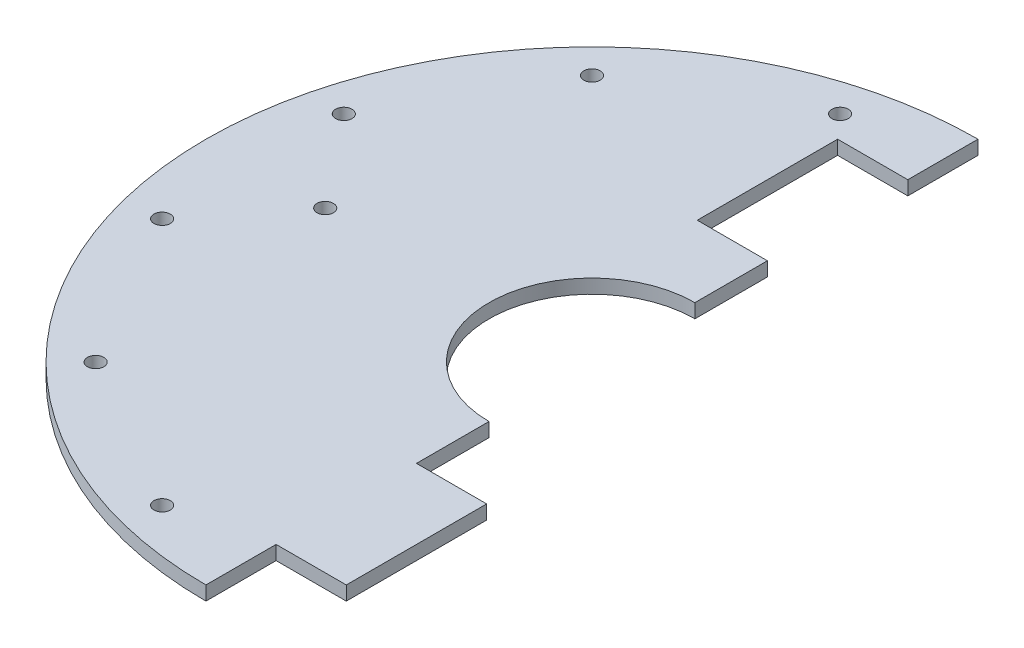
ISO-10303-21;
HEADER;
FILE_DESCRIPTION(('STEP AP214'),'2;1');
FILE_NAME('part.step','',(''),(''),'','','');
FILE_SCHEMA(('AUTOMOTIVE_DESIGN { 1 0 10303 214 1 1 1 1 }'));
ENDSEC;
DATA;
#1=APPLICATION_CONTEXT('core data for automotive mechanical design processes');
#2=APPLICATION_PROTOCOL_DEFINITION('international standard','automotive_design',2000,#1);
#3=PRODUCT_CONTEXT('',#1,'mechanical');
#4=PRODUCT('Part','Part','',(#3));
#5=PRODUCT_RELATED_PRODUCT_CATEGORY('part','',(#4));
#6=PRODUCT_DEFINITION_FORMATION('','',#4);
#7=PRODUCT_DEFINITION_CONTEXT('part definition',#1,'design');
#8=PRODUCT_DEFINITION('design','',#6,#7);
#9=PRODUCT_DEFINITION_SHAPE('','',#8);
#10=(LENGTH_UNIT() NAMED_UNIT(*) SI_UNIT(.MILLI.,.METRE.));
#11=(NAMED_UNIT(*) PLANE_ANGLE_UNIT() SI_UNIT($,.RADIAN.));
#12=(NAMED_UNIT(*) SI_UNIT($,.STERADIAN.) SOLID_ANGLE_UNIT());
#13=UNCERTAINTY_MEASURE_WITH_UNIT(LENGTH_MEASURE(1.E-05),#10,'distance_accuracy_value','');
#14=(GEOMETRIC_REPRESENTATION_CONTEXT(3) GLOBAL_UNCERTAINTY_ASSIGNED_CONTEXT((#13)) GLOBAL_UNIT_ASSIGNED_CONTEXT((#10,
#11,#12)) REPRESENTATION_CONTEXT('',''));
#15=CARTESIAN_POINT('',(0.,0.,0.));
#16=DIRECTION('',(0.,0.,1.));
#17=DIRECTION('',(1.,0.,0.));
#18=AXIS2_PLACEMENT_3D('',#15,#16,#17);
#19=CARTESIAN_POINT('',(0.,3.,0.));
#20=DIRECTION('',(0.,-1.,0.));
#21=DIRECTION('',(0.,0.,-1.));
#22=AXIS2_PLACEMENT_3D('',#19,#20,#21);
#23=CYLINDRICAL_SURFACE('',#22,82.5);
#24=DIRECTION('',(0.,1.,0.));
#25=VECTOR('',#24,1.);
#26=CARTESIAN_POINT('',(0.,0.,-82.5));
#27=LINE('',#26,#25);
#28=CARTESIAN_POINT('',(0.,0.,-82.5));
#29=VERTEX_POINT('',#28);
#30=CARTESIAN_POINT('',(0.,3.,-82.5));
#31=VERTEX_POINT('',#30);
#32=EDGE_CURVE('E128',#29,#31,#27,.T.);
#33=ORIENTED_EDGE('',*,*,#32,.F.);
#34=CARTESIAN_POINT('',(0.,0.,0.));
#35=DIRECTION('',(0.,1.,0.));
#36=DIRECTION('',(0.,0.,1.));
#37=AXIS2_PLACEMENT_3D('',#34,#35,#36);
#38=CIRCLE('',#37,82.5);
#39=CARTESIAN_POINT('',(0.,0.,82.5));
#40=VERTEX_POINT('',#39);
#41=EDGE_CURVE('E40',#29,#40,#38,.T.);
#42=ORIENTED_EDGE('',*,*,#41,.T.);
#43=DIRECTION('',(0.,1.,0.));
#44=VECTOR('',#43,1.);
#45=CARTESIAN_POINT('',(0.,0.,82.5));
#46=LINE('',#45,#44);
#47=CARTESIAN_POINT('',(0.,3.,82.5));
#48=VERTEX_POINT('',#47);
#49=EDGE_CURVE('E143',#40,#48,#46,.T.);
#50=ORIENTED_EDGE('',*,*,#49,.T.);
#51=CARTESIAN_POINT('',(0.,3.,0.));
#52=DIRECTION('',(0.,1.,0.));
#53=DIRECTION('',(0.,0.,1.));
#54=AXIS2_PLACEMENT_3D('',#51,#52,#53);
#55=CIRCLE('',#54,82.5);
#56=EDGE_CURVE('E11',#31,#48,#55,.T.);
#57=ORIENTED_EDGE('',*,*,#56,.F.);
#58=EDGE_LOOP('',(#33,#42,#50,#57));
#59=FACE_BOUND('',#58,.T.);
#60=ADVANCED_FACE('F37',(#59),#23,.T.);
#61=CARTESIAN_POINT('',(0.,3.,0.));
#62=DIRECTION('',(0.,1.,0.));
#63=DIRECTION('',(0.,0.,1.));
#64=AXIS2_PLACEMENT_3D('',#61,#62,#63);
#65=PLANE('',#64);
#66=DIRECTION('',(0.,0.,1.));
#67=VECTOR('',#66,1.);
#68=CARTESIAN_POINT('',(0.,3.,67.5));
#69=LINE('',#68,#67);
#70=CARTESIAN_POINT('',(0.,3.,67.5));
#71=VERTEX_POINT('',#70);
#72=EDGE_CURVE('E414',#71,#48,#69,.T.);
#73=ORIENTED_EDGE('',*,*,#72,.F.);
#74=DIRECTION('',(-1.,0.,0.));
#75=VECTOR('',#74,1.);
#76=CARTESIAN_POINT('',(15.,3.,67.5));
#77=LINE('',#76,#75);
#78=CARTESIAN_POINT('',(15.,3.,67.5));
#79=VERTEX_POINT('',#78);
#80=EDGE_CURVE('E384',#79,#71,#77,.T.);
#81=ORIENTED_EDGE('',*,*,#80,.F.);
#82=DIRECTION('',(0.,0.,1.));
#83=VECTOR('',#82,1.);
#84=CARTESIAN_POINT('',(15.,3.,37.5));
#85=LINE('',#84,#83);
#86=CARTESIAN_POINT('',(15.,3.,37.5));
#87=VERTEX_POINT('',#86);
#88=EDGE_CURVE('E382',#87,#79,#85,.T.);
#89=ORIENTED_EDGE('',*,*,#88,.F.);
#90=DIRECTION('',(1.,0.,0.));
#91=VECTOR('',#90,1.);
#92=CARTESIAN_POINT('',(0.,3.,37.5));
#93=LINE('',#92,#91);
#94=CARTESIAN_POINT('',(0.,3.,37.5));
#95=VERTEX_POINT('',#94);
#96=EDGE_CURVE('E375',#95,#87,#93,.T.);
#97=ORIENTED_EDGE('',*,*,#96,.F.);
#98=DIRECTION('',(0.,0.,1.));
#99=VECTOR('',#98,1.);
#100=CARTESIAN_POINT('',(0.,3.,22.));
#101=LINE('',#100,#99);
#102=CARTESIAN_POINT('',(0.,3.,22.));
#103=VERTEX_POINT('',#102);
#104=EDGE_CURVE('E369',#103,#95,#101,.T.);
#105=ORIENTED_EDGE('',*,*,#104,.F.);
#106=CARTESIAN_POINT('',(0.,3.,0.));
#107=DIRECTION('',(0.,1.,0.));
#108=DIRECTION('',(0.,0.,1.));
#109=AXIS2_PLACEMENT_3D('',#106,#107,#108);
#110=CIRCLE('',#109,22.);
#111=CARTESIAN_POINT('',(0.,3.,-22.));
#112=VERTEX_POINT('',#111);
#113=EDGE_CURVE('E152',#112,#103,#110,.T.);
#114=ORIENTED_EDGE('',*,*,#113,.F.);
#115=DIRECTION('',(0.,0.,1.));
#116=VECTOR('',#115,1.);
#117=CARTESIAN_POINT('',(0.,3.,-37.5));
#118=LINE('',#117,#116);
#119=CARTESIAN_POINT('',(0.,3.,-37.5));
#120=VERTEX_POINT('',#119);
#121=EDGE_CURVE('E51',#120,#112,#118,.T.);
#122=ORIENTED_EDGE('',*,*,#121,.F.);
#123=DIRECTION('',(1.,0.,0.));
#124=VECTOR('',#123,1.);
#125=CARTESIAN_POINT('',(-15.,3.,-37.5));
#126=LINE('',#125,#124);
#127=CARTESIAN_POINT('',(-15.,3.,-37.5));
#128=VERTEX_POINT('',#127);
#129=EDGE_CURVE('E389',#128,#120,#126,.T.);
#130=ORIENTED_EDGE('',*,*,#129,.F.);
#131=DIRECTION('',(0.,0.,1.));
#132=VECTOR('',#131,1.);
#133=CARTESIAN_POINT('',(-15.,3.,-67.5));
#134=LINE('',#133,#132);
#135=CARTESIAN_POINT('',(-15.,3.,-67.5));
#136=VERTEX_POINT('',#135);
#137=EDGE_CURVE('E392',#136,#128,#134,.T.);
#138=ORIENTED_EDGE('',*,*,#137,.F.);
#139=DIRECTION('',(-1.,0.,0.));
#140=VECTOR('',#139,1.);
#141=CARTESIAN_POINT('',(0.,3.,-67.5));
#142=LINE('',#141,#140);
#143=CARTESIAN_POINT('',(0.,3.,-67.5));
#144=VERTEX_POINT('',#143);
#145=EDGE_CURVE('E136',#144,#136,#142,.T.);
#146=ORIENTED_EDGE('',*,*,#145,.F.);
#147=DIRECTION('',(0.,0.,-1.));
#148=VECTOR('',#147,1.);
#149=CARTESIAN_POINT('',(0.,3.,-67.5));
#150=LINE('',#149,#148);
#151=EDGE_CURVE('E416',#144,#31,#150,.T.);
#152=ORIENTED_EDGE('',*,*,#151,.T.);
#153=ORIENTED_EDGE('',*,*,#56,.T.);
#154=EDGE_LOOP('',(#73,#81,#89,#97,#105,#114,#122,#130,#138,#146,#152,#153));
#155=FACE_BOUND('',#154,.T.);
#156=CARTESIAN_POINT('',(-19.4114283826883,3.,72.4444369716803));
#157=DIRECTION('',(0.,1.,0.));
#158=DIRECTION('',(-1.,0.,0.));
#159=AXIS2_PLACEMENT_3D('',#156,#157,#158);
#160=CIRCLE('',#159,1.75);
#161=CARTESIAN_POINT('',(-21.1614283826883,3.,72.4444369716803));
#162=VERTEX_POINT('',#161);
#163=EDGE_CURVE('E142',#162,#162,#160,.T.);
#164=ORIENTED_EDGE('',*,*,#163,.F.);
#165=EDGE_LOOP('',(#164));
#166=FACE_BOUND('',#165,.T.);
#167=CARTESIAN_POINT('',(-53.0330085889906,3.,53.0330085889915));
#168=DIRECTION('',(0.,1.,0.));
#169=DIRECTION('',(-0.866025403784443,0.,-0.499999999999992));
#170=AXIS2_PLACEMENT_3D('',#167,#168,#169);
#171=CIRCLE('',#170,1.75);
#172=CARTESIAN_POINT('',(-54.5485530456134,3.,52.1580085889915));
#173=VERTEX_POINT('',#172);
#174=EDGE_CURVE('E199',#173,#173,#171,.T.);
#175=ORIENTED_EDGE('',*,*,#174,.F.);
#176=EDGE_LOOP('',(#175));
#177=FACE_BOUND('',#176,.T.);
#178=CARTESIAN_POINT('',(-72.44443697168,3.,19.4114283826896));
#179=DIRECTION('',(0.,1.,0.));
#180=DIRECTION('',(-0.500000000000007,0.,-0.866025403784435));
#181=AXIS2_PLACEMENT_3D('',#178,#179,#180);
#182=CIRCLE('',#181,1.75);
#183=CARTESIAN_POINT('',(-73.31943697168,3.,17.8958839260668));
#184=VERTEX_POINT('',#183);
#185=EDGE_CURVE('E193',#184,#184,#182,.T.);
#186=ORIENTED_EDGE('',*,*,#185,.F.);
#187=EDGE_LOOP('',(#186));
#188=FACE_BOUND('',#187,.T.);
#189=CARTESIAN_POINT('',(-72.4444369716801,3.,-19.4114283826891));
#190=DIRECTION('',(0.,1.,0.));
#191=DIRECTION('',(0.,0.,-1.));
#192=AXIS2_PLACEMENT_3D('',#189,#190,#191);
#193=CIRCLE('',#192,1.75);
#194=CARTESIAN_POINT('',(-72.4444369716801,3.,-21.1614283826891));
#195=VERTEX_POINT('',#194);
#196=EDGE_CURVE('E187',#195,#195,#193,.T.);
#197=ORIENTED_EDGE('',*,*,#196,.F.);
#198=EDGE_LOOP('',(#197));
#199=FACE_BOUND('',#198,.T.);
#200=CARTESIAN_POINT('',(-53.0330085889913,3.,-53.0330085889908));
#201=DIRECTION('',(0.,1.,0.));
#202=DIRECTION('',(0.499999999999995,0.,-0.866025403784442));
#203=AXIS2_PLACEMENT_3D('',#200,#201,#202);
#204=CIRCLE('',#203,1.75);
#205=CARTESIAN_POINT('',(-52.1580085889914,3.,-54.5485530456136));
#206=VERTEX_POINT('',#205);
#207=EDGE_CURVE('E181',#206,#206,#204,.T.);
#208=ORIENTED_EDGE('',*,*,#207,.F.);
#209=EDGE_LOOP('',(#208));
#210=FACE_BOUND('',#209,.T.);
#211=CARTESIAN_POINT('',(-19.4114283826894,3.,-72.4444369716801));
#212=DIRECTION('',(0.,1.,0.));
#213=DIRECTION('',(0.866025403784436,0.,-0.500000000000004));
#214=AXIS2_PLACEMENT_3D('',#211,#212,#213);
#215=CIRCLE('',#214,1.75);
#216=CARTESIAN_POINT('',(-17.8958839260666,3.,-73.3194369716801));
#217=VERTEX_POINT('',#216);
#218=EDGE_CURVE('E170',#217,#217,#215,.T.);
#219=ORIENTED_EDGE('',*,*,#218,.F.);
#220=EDGE_LOOP('',(#219));
#221=FACE_BOUND('',#220,.T.);
#222=CARTESIAN_POINT('',(-57.,3.,0.));
#223=DIRECTION('',(0.,1.,0.));
#224=DIRECTION('',(0.,0.,1.));
#225=AXIS2_PLACEMENT_3D('',#222,#223,#224);
#226=CIRCLE('',#225,1.75);
#227=CARTESIAN_POINT('',(-57.,3.,1.75));
#228=VERTEX_POINT('',#227);
#229=EDGE_CURVE('E164',#228,#228,#226,.T.);
#230=ORIENTED_EDGE('',*,*,#229,.F.);
#231=EDGE_LOOP('',(#230));
#232=FACE_BOUND('',#231,.T.);
#233=ADVANCED_FACE('F209',(#155,#166,#177,#188,#199,#210,#221,#232),#65,.T.);
#234=CARTESIAN_POINT('',(0.,0.,0.));
#235=DIRECTION('',(0.,1.,0.));
#236=DIRECTION('',(0.,0.,1.));
#237=AXIS2_PLACEMENT_3D('',#234,#235,#236);
#238=PLANE('',#237);
#239=DIRECTION('',(-1.,0.,0.));
#240=VECTOR('',#239,1.);
#241=CARTESIAN_POINT('',(15.,0.,67.5));
#242=LINE('',#241,#240);
#243=CARTESIAN_POINT('',(15.,0.,67.5));
#244=VERTEX_POINT('',#243);
#245=CARTESIAN_POINT('',(0.,0.,67.5));
#246=VERTEX_POINT('',#245);
#247=EDGE_CURVE('E424',#244,#246,#242,.T.);
#248=ORIENTED_EDGE('',*,*,#247,.T.);
#249=DIRECTION('',(0.,0.,1.));
#250=VECTOR('',#249,1.);
#251=CARTESIAN_POINT('',(0.,0.,67.5));
#252=LINE('',#251,#250);
#253=EDGE_CURVE('E135',#246,#40,#252,.T.);
#254=ORIENTED_EDGE('',*,*,#253,.T.);
#255=ORIENTED_EDGE('',*,*,#41,.F.);
#256=DIRECTION('',(0.,0.,-1.));
#257=VECTOR('',#256,1.);
#258=CARTESIAN_POINT('',(0.,0.,-67.5));
#259=LINE('',#258,#257);
#260=CARTESIAN_POINT('',(0.,0.,-67.5));
#261=VERTEX_POINT('',#260);
#262=EDGE_CURVE('E124',#261,#29,#259,.T.);
#263=ORIENTED_EDGE('',*,*,#262,.F.);
#264=DIRECTION('',(-1.,0.,0.));
#265=VECTOR('',#264,1.);
#266=CARTESIAN_POINT('',(0.,0.,-67.5));
#267=LINE('',#266,#265);
#268=CARTESIAN_POINT('',(-15.,0.,-67.5));
#269=VERTEX_POINT('',#268);
#270=EDGE_CURVE('E399',#261,#269,#267,.T.);
#271=ORIENTED_EDGE('',*,*,#270,.T.);
#272=DIRECTION('',(0.,0.,1.));
#273=VECTOR('',#272,1.);
#274=CARTESIAN_POINT('',(-15.,0.,-67.5));
#275=LINE('',#274,#273);
#276=CARTESIAN_POINT('',(-15.,0.,-37.5));
#277=VERTEX_POINT('',#276);
#278=EDGE_CURVE('E438',#269,#277,#275,.T.);
#279=ORIENTED_EDGE('',*,*,#278,.T.);
#280=DIRECTION('',(1.,0.,0.));
#281=VECTOR('',#280,1.);
#282=CARTESIAN_POINT('',(-15.,0.,-37.5));
#283=LINE('',#282,#281);
#284=CARTESIAN_POINT('',(0.,0.,-37.5));
#285=VERTEX_POINT('',#284);
#286=EDGE_CURVE('E433',#277,#285,#283,.T.);
#287=ORIENTED_EDGE('',*,*,#286,.T.);
#288=DIRECTION('',(0.,0.,1.));
#289=VECTOR('',#288,1.);
#290=CARTESIAN_POINT('',(0.,0.,-37.5));
#291=LINE('',#290,#289);
#292=CARTESIAN_POINT('',(0.,0.,-22.));
#293=VERTEX_POINT('',#292);
#294=EDGE_CURVE('E431',#285,#293,#291,.T.);
#295=ORIENTED_EDGE('',*,*,#294,.T.);
#296=CARTESIAN_POINT('',(0.,0.,0.));
#297=DIRECTION('',(0.,1.,0.));
#298=DIRECTION('',(0.,0.,1.));
#299=AXIS2_PLACEMENT_3D('',#296,#297,#298);
#300=CIRCLE('',#299,22.);
#301=CARTESIAN_POINT('',(0.,0.,22.));
#302=VERTEX_POINT('',#301);
#303=EDGE_CURVE('E150',#293,#302,#300,.T.);
#304=ORIENTED_EDGE('',*,*,#303,.T.);
#305=DIRECTION('',(0.,0.,1.));
#306=VECTOR('',#305,1.);
#307=CARTESIAN_POINT('',(0.,0.,22.));
#308=LINE('',#307,#306);
#309=CARTESIAN_POINT('',(0.,0.,37.5));
#310=VERTEX_POINT('',#309);
#311=EDGE_CURVE('E59',#302,#310,#308,.T.);
#312=ORIENTED_EDGE('',*,*,#311,.T.);
#313=DIRECTION('',(1.,0.,0.));
#314=VECTOR('',#313,1.);
#315=CARTESIAN_POINT('',(0.,0.,37.5));
#316=LINE('',#315,#314);
#317=CARTESIAN_POINT('',(15.,0.,37.5));
#318=VERTEX_POINT('',#317);
#319=EDGE_CURVE('E429',#310,#318,#316,.T.);
#320=ORIENTED_EDGE('',*,*,#319,.T.);
#321=DIRECTION('',(0.,0.,1.));
#322=VECTOR('',#321,1.);
#323=CARTESIAN_POINT('',(15.,0.,37.5));
#324=LINE('',#323,#322);
#325=EDGE_CURVE('E427',#318,#244,#324,.T.);
#326=ORIENTED_EDGE('',*,*,#325,.T.);
#327=EDGE_LOOP('',(#248,#254,#255,#263,#271,#279,#287,#295,#304,#312,#320,#326));
#328=FACE_BOUND('',#327,.T.);
#329=CARTESIAN_POINT('',(-19.4114283826883,0.,72.4444369716803));
#330=DIRECTION('',(0.,1.,0.));
#331=DIRECTION('',(-1.,0.,0.));
#332=AXIS2_PLACEMENT_3D('',#329,#330,#331);
#333=CIRCLE('',#332,1.75);
#334=CARTESIAN_POINT('',(-21.1614283826883,0.,72.4444369716803));
#335=VERTEX_POINT('',#334);
#336=EDGE_CURVE('E201',#335,#335,#333,.T.);
#337=ORIENTED_EDGE('',*,*,#336,.T.);
#338=EDGE_LOOP('',(#337));
#339=FACE_BOUND('',#338,.T.);
#340=CARTESIAN_POINT('',(-53.0330085889906,0.,53.0330085889915));
#341=DIRECTION('',(0.,1.,0.));
#342=DIRECTION('',(-0.866025403784443,0.,-0.499999999999992));
#343=AXIS2_PLACEMENT_3D('',#340,#341,#342);
#344=CIRCLE('',#343,1.75);
#345=CARTESIAN_POINT('',(-54.5485530456134,0.,52.1580085889915));
#346=VERTEX_POINT('',#345);
#347=EDGE_CURVE('E196',#346,#346,#344,.T.);
#348=ORIENTED_EDGE('',*,*,#347,.T.);
#349=EDGE_LOOP('',(#348));
#350=FACE_BOUND('',#349,.T.);
#351=CARTESIAN_POINT('',(-72.44443697168,0.,19.4114283826896));
#352=DIRECTION('',(0.,1.,0.));
#353=DIRECTION('',(-0.500000000000007,0.,-0.866025403784435));
#354=AXIS2_PLACEMENT_3D('',#351,#352,#353);
#355=CIRCLE('',#354,1.75);
#356=CARTESIAN_POINT('',(-73.31943697168,0.,17.8958839260668));
#357=VERTEX_POINT('',#356);
#358=EDGE_CURVE('E190',#357,#357,#355,.T.);
#359=ORIENTED_EDGE('',*,*,#358,.T.);
#360=EDGE_LOOP('',(#359));
#361=FACE_BOUND('',#360,.T.);
#362=CARTESIAN_POINT('',(-72.4444369716801,0.,-19.4114283826891));
#363=DIRECTION('',(0.,1.,0.));
#364=DIRECTION('',(0.,0.,-1.));
#365=AXIS2_PLACEMENT_3D('',#362,#363,#364);
#366=CIRCLE('',#365,1.75);
#367=CARTESIAN_POINT('',(-72.4444369716801,0.,-21.1614283826891));
#368=VERTEX_POINT('',#367);
#369=EDGE_CURVE('E184',#368,#368,#366,.T.);
#370=ORIENTED_EDGE('',*,*,#369,.T.);
#371=EDGE_LOOP('',(#370));
#372=FACE_BOUND('',#371,.T.);
#373=CARTESIAN_POINT('',(-53.0330085889913,0.,-53.0330085889908));
#374=DIRECTION('',(0.,1.,0.));
#375=DIRECTION('',(0.499999999999995,0.,-0.866025403784442));
#376=AXIS2_PLACEMENT_3D('',#373,#374,#375);
#377=CIRCLE('',#376,1.75);
#378=CARTESIAN_POINT('',(-52.1580085889914,0.,-54.5485530456136));
#379=VERTEX_POINT('',#378);
#380=EDGE_CURVE('E175',#379,#379,#377,.T.);
#381=ORIENTED_EDGE('',*,*,#380,.T.);
#382=EDGE_LOOP('',(#381));
#383=FACE_BOUND('',#382,.T.);
#384=CARTESIAN_POINT('',(-19.4114283826894,0.,-72.4444369716801));
#385=DIRECTION('',(0.,1.,0.));
#386=DIRECTION('',(0.866025403784436,0.,-0.500000000000004));
#387=AXIS2_PLACEMENT_3D('',#384,#385,#386);
#388=CIRCLE('',#387,1.75);
#389=CARTESIAN_POINT('',(-17.8958839260666,0.,-73.3194369716801));
#390=VERTEX_POINT('',#389);
#391=EDGE_CURVE('E166',#390,#390,#388,.T.);
#392=ORIENTED_EDGE('',*,*,#391,.T.);
#393=EDGE_LOOP('',(#392));
#394=FACE_BOUND('',#393,.T.);
#395=CARTESIAN_POINT('',(-57.,0.,0.));
#396=DIRECTION('',(0.,1.,0.));
#397=DIRECTION('',(0.,0.,1.));
#398=AXIS2_PLACEMENT_3D('',#395,#396,#397);
#399=CIRCLE('',#398,1.75);
#400=CARTESIAN_POINT('',(-57.,0.,1.75));
#401=VERTEX_POINT('',#400);
#402=EDGE_CURVE('E157',#401,#401,#399,.T.);
#403=ORIENTED_EDGE('',*,*,#402,.T.);
#404=EDGE_LOOP('',(#403));
#405=FACE_BOUND('',#404,.T.);
#406=ADVANCED_FACE('F147',(#328,#339,#350,#361,#372,#383,#394,#405),#238,.F.);
#407=CARTESIAN_POINT('',(-57.,0.,0.));
#408=DIRECTION('',(0.,1.,0.));
#409=DIRECTION('',(0.,0.,1.));
#410=AXIS2_PLACEMENT_3D('',#407,#408,#409);
#411=CYLINDRICAL_SURFACE('',#410,1.75);
#412=ORIENTED_EDGE('',*,*,#402,.F.);
#413=EDGE_LOOP('',(#412));
#414=FACE_BOUND('',#413,.T.);
#415=ORIENTED_EDGE('',*,*,#229,.T.);
#416=EDGE_LOOP('',(#415));
#417=FACE_BOUND('',#416,.T.);
#418=ADVANCED_FACE('F238',(#414,#417),#411,.F.);
#419=CARTESIAN_POINT('',(0.,0.,0.));
#420=DIRECTION('',(0.,1.,0.));
#421=DIRECTION('',(0.,0.,1.));
#422=AXIS2_PLACEMENT_3D('',#419,#420,#421);
#423=CYLINDRICAL_SURFACE('',#422,22.);
#424=ORIENTED_EDGE('',*,*,#113,.T.);
#425=DIRECTION('',(0.,1.,0.));
#426=VECTOR('',#425,1.);
#427=CARTESIAN_POINT('',(0.,0.,22.));
#428=LINE('',#427,#426);
#429=EDGE_CURVE('E373',#302,#103,#428,.T.);
#430=ORIENTED_EDGE('',*,*,#429,.F.);
#431=ORIENTED_EDGE('',*,*,#303,.F.);
#432=DIRECTION('',(0.,1.,0.));
#433=VECTOR('',#432,1.);
#434=CARTESIAN_POINT('',(0.,0.,-22.));
#435=LINE('',#434,#433);
#436=EDGE_CURVE('E405',#293,#112,#435,.T.);
#437=ORIENTED_EDGE('',*,*,#436,.T.);
#438=EDGE_LOOP('',(#424,#430,#431,#437));
#439=FACE_BOUND('',#438,.T.);
#440=ADVANCED_FACE('F228',(#439),#423,.F.);
#441=CARTESIAN_POINT('',(-19.4114283826894,0.,-72.4444369716801));
#442=DIRECTION('',(0.,1.,0.));
#443=DIRECTION('',(0.,0.,1.));
#444=AXIS2_PLACEMENT_3D('',#441,#442,#443);
#445=CYLINDRICAL_SURFACE('',#444,1.75);
#446=ORIENTED_EDGE('',*,*,#391,.F.);
#447=EDGE_LOOP('',(#446));
#448=FACE_BOUND('',#447,.T.);
#449=ORIENTED_EDGE('',*,*,#218,.T.);
#450=EDGE_LOOP('',(#449));
#451=FACE_BOUND('',#450,.T.);
#452=ADVANCED_FACE('F225',(#448,#451),#445,.F.);
#453=CARTESIAN_POINT('',(-53.0330085889913,0.,-53.0330085889908));
#454=DIRECTION('',(0.,1.,0.));
#455=DIRECTION('',(0.,0.,1.));
#456=AXIS2_PLACEMENT_3D('',#453,#454,#455);
#457=CYLINDRICAL_SURFACE('',#456,1.75);
#458=ORIENTED_EDGE('',*,*,#380,.F.);
#459=EDGE_LOOP('',(#458));
#460=FACE_BOUND('',#459,.T.);
#461=ORIENTED_EDGE('',*,*,#207,.T.);
#462=EDGE_LOOP('',(#461));
#463=FACE_BOUND('',#462,.T.);
#464=ADVANCED_FACE('F227',(#460,#463),#457,.F.);
#465=CARTESIAN_POINT('',(-72.4444369716801,0.,-19.4114283826891));
#466=DIRECTION('',(0.,1.,0.));
#467=DIRECTION('',(0.,0.,1.));
#468=AXIS2_PLACEMENT_3D('',#465,#466,#467);
#469=CYLINDRICAL_SURFACE('',#468,1.75);
#470=ORIENTED_EDGE('',*,*,#369,.F.);
#471=EDGE_LOOP('',(#470));
#472=FACE_BOUND('',#471,.T.);
#473=ORIENTED_EDGE('',*,*,#196,.T.);
#474=EDGE_LOOP('',(#473));
#475=FACE_BOUND('',#474,.T.);
#476=ADVANCED_FACE('F235',(#472,#475),#469,.F.);
#477=CARTESIAN_POINT('',(-72.44443697168,0.,19.4114283826896));
#478=DIRECTION('',(0.,1.,0.));
#479=DIRECTION('',(0.,0.,1.));
#480=AXIS2_PLACEMENT_3D('',#477,#478,#479);
#481=CYLINDRICAL_SURFACE('',#480,1.75);
#482=ORIENTED_EDGE('',*,*,#358,.F.);
#483=EDGE_LOOP('',(#482));
#484=FACE_BOUND('',#483,.T.);
#485=ORIENTED_EDGE('',*,*,#185,.T.);
#486=EDGE_LOOP('',(#485));
#487=FACE_BOUND('',#486,.T.);
#488=ADVANCED_FACE('F456',(#484,#487),#481,.F.);
#489=CARTESIAN_POINT('',(-53.0330085889906,0.,53.0330085889915));
#490=DIRECTION('',(0.,1.,0.));
#491=DIRECTION('',(0.,0.,1.));
#492=AXIS2_PLACEMENT_3D('',#489,#490,#491);
#493=CYLINDRICAL_SURFACE('',#492,1.75);
#494=ORIENTED_EDGE('',*,*,#347,.F.);
#495=EDGE_LOOP('',(#494));
#496=FACE_BOUND('',#495,.T.);
#497=ORIENTED_EDGE('',*,*,#174,.T.);
#498=EDGE_LOOP('',(#497));
#499=FACE_BOUND('',#498,.T.);
#500=ADVANCED_FACE('F448',(#496,#499),#493,.F.);
#501=CARTESIAN_POINT('',(-19.4114283826883,0.,72.4444369716803));
#502=DIRECTION('',(0.,1.,0.));
#503=DIRECTION('',(0.,0.,1.));
#504=AXIS2_PLACEMENT_3D('',#501,#502,#503);
#505=CYLINDRICAL_SURFACE('',#504,1.75);
#506=ORIENTED_EDGE('',*,*,#336,.F.);
#507=EDGE_LOOP('',(#506));
#508=FACE_BOUND('',#507,.T.);
#509=ORIENTED_EDGE('',*,*,#163,.T.);
#510=EDGE_LOOP('',(#509));
#511=FACE_BOUND('',#510,.T.);
#512=ADVANCED_FACE('F207',(#508,#511),#505,.F.);
#513=CARTESIAN_POINT('',(0.,0.,-37.5));
#514=DIRECTION('',(-1.,0.,0.));
#515=DIRECTION('',(0.,0.,1.));
#516=AXIS2_PLACEMENT_3D('',#513,#514,#515);
#517=PLANE('',#516);
#518=ORIENTED_EDGE('',*,*,#121,.T.);
#519=ORIENTED_EDGE('',*,*,#436,.F.);
#520=ORIENTED_EDGE('',*,*,#294,.F.);
#521=DIRECTION('',(0.,1.,0.));
#522=VECTOR('',#521,1.);
#523=CARTESIAN_POINT('',(0.,0.,-37.5));
#524=LINE('',#523,#522);
#525=EDGE_CURVE('E403',#285,#120,#524,.T.);
#526=ORIENTED_EDGE('',*,*,#525,.T.);
#527=EDGE_LOOP('',(#518,#519,#520,#526));
#528=FACE_BOUND('',#527,.T.);
#529=ADVANCED_FACE('F272',(#528),#517,.F.);
#530=CARTESIAN_POINT('',(0.,0.,-67.5));
#531=DIRECTION('',(0.,0.,-1.));
#532=DIRECTION('',(-1.,0.,0.));
#533=AXIS2_PLACEMENT_3D('',#530,#531,#532);
#534=PLANE('',#533);
#535=ORIENTED_EDGE('',*,*,#145,.T.);
#536=DIRECTION('',(0.,1.,0.));
#537=VECTOR('',#536,1.);
#538=CARTESIAN_POINT('',(-15.,0.,-67.5));
#539=LINE('',#538,#537);
#540=EDGE_CURVE('E398',#269,#136,#539,.T.);
#541=ORIENTED_EDGE('',*,*,#540,.F.);
#542=ORIENTED_EDGE('',*,*,#270,.F.);
#543=DIRECTION('',(0.,1.,0.));
#544=VECTOR('',#543,1.);
#545=CARTESIAN_POINT('',(0.,0.,-67.5));
#546=LINE('',#545,#544);
#547=EDGE_CURVE('E130',#261,#144,#546,.T.);
#548=ORIENTED_EDGE('',*,*,#547,.T.);
#549=EDGE_LOOP('',(#535,#541,#542,#548));
#550=FACE_BOUND('',#549,.T.);
#551=ADVANCED_FACE('F277',(#550),#534,.F.);
#552=CARTESIAN_POINT('',(-15.,0.,-67.5));
#553=DIRECTION('',(-1.,0.,0.));
#554=DIRECTION('',(0.,0.,1.));
#555=AXIS2_PLACEMENT_3D('',#552,#553,#554);
#556=PLANE('',#555);
#557=ORIENTED_EDGE('',*,*,#137,.T.);
#558=DIRECTION('',(0.,1.,0.));
#559=VECTOR('',#558,1.);
#560=CARTESIAN_POINT('',(-15.,0.,-37.5));
#561=LINE('',#560,#559);
#562=EDGE_CURVE('E401',#277,#128,#561,.T.);
#563=ORIENTED_EDGE('',*,*,#562,.F.);
#564=ORIENTED_EDGE('',*,*,#278,.F.);
#565=ORIENTED_EDGE('',*,*,#540,.T.);
#566=EDGE_LOOP('',(#557,#563,#564,#565));
#567=FACE_BOUND('',#566,.T.);
#568=ADVANCED_FACE('F287',(#567),#556,.F.);
#569=CARTESIAN_POINT('',(-15.,0.,-37.5));
#570=DIRECTION('',(0.,0.,1.));
#571=DIRECTION('',(1.,0.,0.));
#572=AXIS2_PLACEMENT_3D('',#569,#570,#571);
#573=PLANE('',#572);
#574=ORIENTED_EDGE('',*,*,#129,.T.);
#575=ORIENTED_EDGE('',*,*,#525,.F.);
#576=ORIENTED_EDGE('',*,*,#286,.F.);
#577=ORIENTED_EDGE('',*,*,#562,.T.);
#578=EDGE_LOOP('',(#574,#575,#576,#577));
#579=FACE_BOUND('',#578,.T.);
#580=ADVANCED_FACE('F297',(#579),#573,.F.);
#581=CARTESIAN_POINT('',(0.,0.,-67.5));
#582=DIRECTION('',(1.,0.,0.));
#583=DIRECTION('',(0.,0.,-1.));
#584=AXIS2_PLACEMENT_3D('',#581,#582,#583);
#585=PLANE('',#584);
#586=ORIENTED_EDGE('',*,*,#151,.F.);
#587=ORIENTED_EDGE('',*,*,#547,.F.);
#588=ORIENTED_EDGE('',*,*,#262,.T.);
#589=ORIENTED_EDGE('',*,*,#32,.T.);
#590=EDGE_LOOP('',(#586,#587,#588,#589));
#591=FACE_BOUND('',#590,.T.);
#592=ADVANCED_FACE('F127',(#591),#585,.T.);
#593=CARTESIAN_POINT('',(0.,0.,67.5));
#594=DIRECTION('',(-1.,0.,0.));
#595=DIRECTION('',(0.,0.,1.));
#596=AXIS2_PLACEMENT_3D('',#593,#594,#595);
#597=PLANE('',#596);
#598=ORIENTED_EDGE('',*,*,#72,.T.);
#599=ORIENTED_EDGE('',*,*,#49,.F.);
#600=ORIENTED_EDGE('',*,*,#253,.F.);
#601=DIRECTION('',(0.,1.,0.));
#602=VECTOR('',#601,1.);
#603=CARTESIAN_POINT('',(0.,0.,67.5));
#604=LINE('',#603,#602);
#605=EDGE_CURVE('E413',#246,#71,#604,.T.);
#606=ORIENTED_EDGE('',*,*,#605,.T.);
#607=EDGE_LOOP('',(#598,#599,#600,#606));
#608=FACE_BOUND('',#607,.T.);
#609=ADVANCED_FACE('F316',(#608),#597,.F.);
#610=CARTESIAN_POINT('',(15.,0.,67.5));
#611=DIRECTION('',(0.,0.,-1.));
#612=DIRECTION('',(-1.,0.,0.));
#613=AXIS2_PLACEMENT_3D('',#610,#611,#612);
#614=PLANE('',#613);
#615=ORIENTED_EDGE('',*,*,#80,.T.);
#616=ORIENTED_EDGE('',*,*,#605,.F.);
#617=ORIENTED_EDGE('',*,*,#247,.F.);
#618=DIRECTION('',(0.,1.,0.));
#619=VECTOR('',#618,1.);
#620=CARTESIAN_POINT('',(15.,0.,67.5));
#621=LINE('',#620,#619);
#622=EDGE_CURVE('E411',#244,#79,#621,.T.);
#623=ORIENTED_EDGE('',*,*,#622,.T.);
#624=EDGE_LOOP('',(#615,#616,#617,#623));
#625=FACE_BOUND('',#624,.T.);
#626=ADVANCED_FACE('F324',(#625),#614,.F.);
#627=CARTESIAN_POINT('',(15.,0.,37.5));
#628=DIRECTION('',(-1.,0.,0.));
#629=DIRECTION('',(0.,0.,1.));
#630=AXIS2_PLACEMENT_3D('',#627,#628,#629);
#631=PLANE('',#630);
#632=ORIENTED_EDGE('',*,*,#88,.T.);
#633=ORIENTED_EDGE('',*,*,#622,.F.);
#634=ORIENTED_EDGE('',*,*,#325,.F.);
#635=DIRECTION('',(0.,1.,0.));
#636=VECTOR('',#635,1.);
#637=CARTESIAN_POINT('',(15.,0.,37.5));
#638=LINE('',#637,#636);
#639=EDGE_CURVE('E409',#318,#87,#638,.T.);
#640=ORIENTED_EDGE('',*,*,#639,.T.);
#641=EDGE_LOOP('',(#632,#633,#634,#640));
#642=FACE_BOUND('',#641,.T.);
#643=ADVANCED_FACE('F334',(#642),#631,.F.);
#644=CARTESIAN_POINT('',(0.,0.,37.5));
#645=DIRECTION('',(0.,0.,1.));
#646=DIRECTION('',(1.,0.,0.));
#647=AXIS2_PLACEMENT_3D('',#644,#645,#646);
#648=PLANE('',#647);
#649=ORIENTED_EDGE('',*,*,#96,.T.);
#650=ORIENTED_EDGE('',*,*,#639,.F.);
#651=ORIENTED_EDGE('',*,*,#319,.F.);
#652=DIRECTION('',(0.,1.,0.));
#653=VECTOR('',#652,1.);
#654=CARTESIAN_POINT('',(0.,0.,37.5));
#655=LINE('',#654,#653);
#656=EDGE_CURVE('E371',#310,#95,#655,.T.);
#657=ORIENTED_EDGE('',*,*,#656,.T.);
#658=EDGE_LOOP('',(#649,#650,#651,#657));
#659=FACE_BOUND('',#658,.T.);
#660=ADVANCED_FACE('F344',(#659),#648,.F.);
#661=CARTESIAN_POINT('',(0.,0.,22.));
#662=DIRECTION('',(-1.,0.,0.));
#663=DIRECTION('',(0.,0.,1.));
#664=AXIS2_PLACEMENT_3D('',#661,#662,#663);
#665=PLANE('',#664);
#666=ORIENTED_EDGE('',*,*,#104,.T.);
#667=ORIENTED_EDGE('',*,*,#656,.F.);
#668=ORIENTED_EDGE('',*,*,#311,.F.);
#669=ORIENTED_EDGE('',*,*,#429,.T.);
#670=EDGE_LOOP('',(#666,#667,#668,#669));
#671=FACE_BOUND('',#670,.T.);
#672=ADVANCED_FACE('F354',(#671),#665,.F.);
#673=CLOSED_SHELL('',(#60,#233,#406,#418,#440,#452,#464,#476,#488,#500,#512,#529,#551,#568,#580,
#592,#609,#626,#643,#660,#672));
#674=MANIFOLD_SOLID_BREP('B2',#673);
#675=ADVANCED_BREP_SHAPE_REPRESENTATION('',(#18,#674),#14);
#676=SHAPE_DEFINITION_REPRESENTATION(#9,#675);
ENDSEC;
END-ISO-10303-21;
